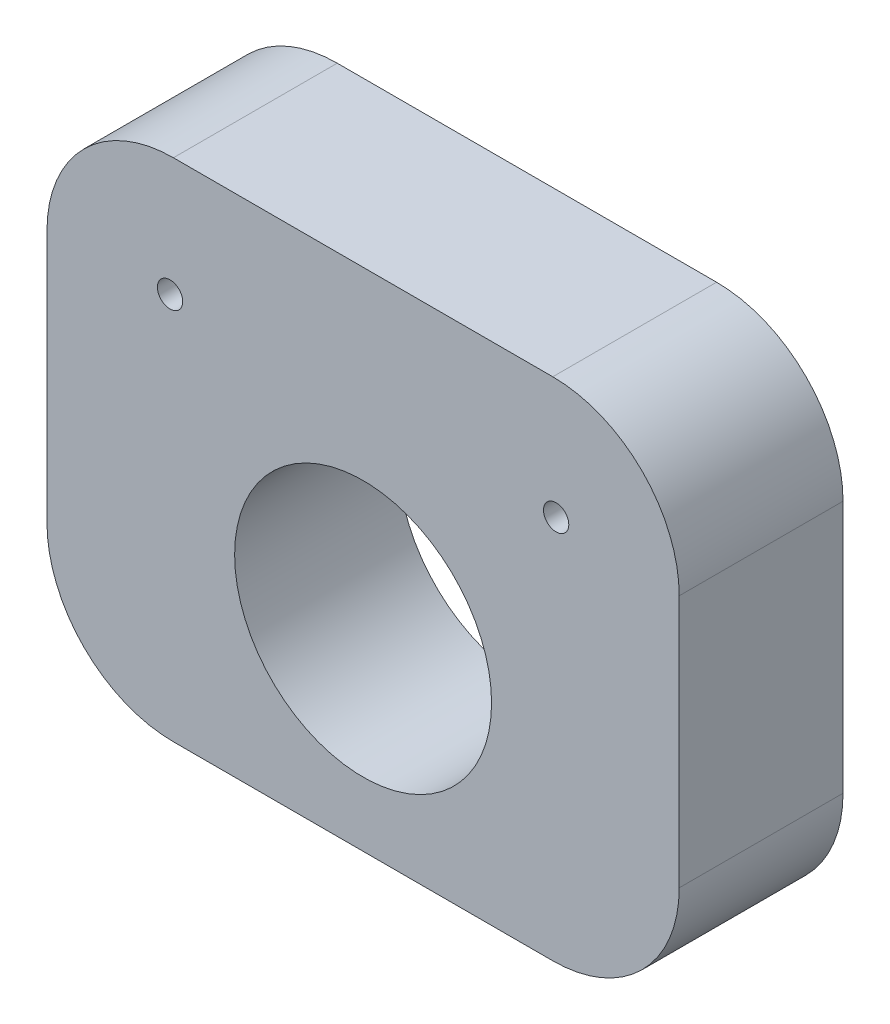
ISO-10303-21;
HEADER;
FILE_DESCRIPTION(('STEP AP214'),'2;1');
FILE_NAME('part.step','',(''),(''),'','','');
FILE_SCHEMA(('AUTOMOTIVE_DESIGN { 1 0 10303 214 1 1 1 1 }'));
ENDSEC;
DATA;
#1=APPLICATION_CONTEXT('core data for automotive mechanical design processes');
#2=APPLICATION_PROTOCOL_DEFINITION('international standard','automotive_design',2000,#1);
#3=PRODUCT_CONTEXT('',#1,'mechanical');
#4=PRODUCT('Part','Part','',(#3));
#5=PRODUCT_RELATED_PRODUCT_CATEGORY('part','',(#4));
#6=PRODUCT_DEFINITION_FORMATION('','',#4);
#7=PRODUCT_DEFINITION_CONTEXT('part definition',#1,'design');
#8=PRODUCT_DEFINITION('design','',#6,#7);
#9=PRODUCT_DEFINITION_SHAPE('','',#8);
#10=(LENGTH_UNIT() NAMED_UNIT(*) SI_UNIT(.MILLI.,.METRE.));
#11=(NAMED_UNIT(*) PLANE_ANGLE_UNIT() SI_UNIT($,.RADIAN.));
#12=(NAMED_UNIT(*) SI_UNIT($,.STERADIAN.) SOLID_ANGLE_UNIT());
#13=UNCERTAINTY_MEASURE_WITH_UNIT(LENGTH_MEASURE(1.E-05),#10,'distance_accuracy_value','');
#14=(GEOMETRIC_REPRESENTATION_CONTEXT(3) GLOBAL_UNCERTAINTY_ASSIGNED_CONTEXT((#13)) GLOBAL_UNIT_ASSIGNED_CONTEXT((#10,
#11,#12)) REPRESENTATION_CONTEXT('',''));
#15=CARTESIAN_POINT('',(0.,0.,0.));
#16=DIRECTION('',(0.,0.,1.));
#17=DIRECTION('',(1.,0.,0.));
#18=AXIS2_PLACEMENT_3D('',#15,#16,#17);
#19=CARTESIAN_POINT('',(-147.757461491775,-155.,0.));
#20=DIRECTION('',(0.,0.,1.));
#21=DIRECTION('',(1.,0.,0.));
#22=AXIS2_PLACEMENT_3D('',#19,#20,#21);
#23=CYLINDRICAL_SURFACE('',#22,5.);
#24=CARTESIAN_POINT('',(-147.757461491775,-155.,6.47700000000003));
#25=DIRECTION('',(0.,0.,-1.));
#26=DIRECTION('',(-1.,0.,0.));
#27=AXIS2_PLACEMENT_3D('',#24,#25,#26);
#28=CIRCLE('',#27,5.);
#29=CARTESIAN_POINT('',(-152.757461491775,-155.,6.47700000000003));
#30=VERTEX_POINT('',#29);
#31=CARTESIAN_POINT('',(-147.757461491775,-150.,6.47700000000003));
#32=VERTEX_POINT('',#31);
#33=EDGE_CURVE('E10',#30,#32,#28,.T.);
#34=ORIENTED_EDGE('',*,*,#33,.T.);
#35=DIRECTION('',(0.,0.,-1.));
#36=VECTOR('',#35,1.);
#37=CARTESIAN_POINT('',(-147.757461491775,-150.,0.));
#38=LINE('',#37,#36);
#39=CARTESIAN_POINT('',(-147.757461491775,-150.,0.));
#40=VERTEX_POINT('',#39);
#41=EDGE_CURVE('E25',#32,#40,#38,.T.);
#42=ORIENTED_EDGE('',*,*,#41,.T.);
#43=CARTESIAN_POINT('',(-147.757461491775,-155.,0.));
#44=DIRECTION('',(0.,0.,1.));
#45=DIRECTION('',(1.,0.,0.));
#46=AXIS2_PLACEMENT_3D('',#43,#44,#45);
#47=CIRCLE('',#46,5.);
#48=CARTESIAN_POINT('',(-152.757461491775,-155.,0.));
#49=VERTEX_POINT('',#48);
#50=EDGE_CURVE('E171',#40,#49,#47,.T.);
#51=ORIENTED_EDGE('',*,*,#50,.T.);
#52=DIRECTION('',(0.,0.,1.));
#53=VECTOR('',#52,1.);
#54=CARTESIAN_POINT('',(-152.757461491775,-155.,0.));
#55=LINE('',#54,#53);
#56=EDGE_CURVE('E218',#49,#30,#55,.T.);
#57=ORIENTED_EDGE('',*,*,#56,.T.);
#58=EDGE_LOOP('',(#34,#42,#51,#57));
#59=FACE_BOUND('',#58,.T.);
#60=ADVANCED_FACE('F15',(#59),#23,.T.);
#61=CARTESIAN_POINT('',(-152.757461491775,-150.,0.));
#62=DIRECTION('',(-1.,0.,0.));
#63=DIRECTION('',(0.,0.,1.));
#64=AXIS2_PLACEMENT_3D('',#61,#62,#63);
#65=PLANE('',#64);
#66=ORIENTED_EDGE('',*,*,#56,.F.);
#67=DIRECTION('',(0.,1.,0.));
#68=VECTOR('',#67,1.);
#69=CARTESIAN_POINT('',(-152.757461491775,-170.,0.));
#70=LINE('',#69,#68);
#71=CARTESIAN_POINT('',(-152.757461491775,-165.,0.));
#72=VERTEX_POINT('',#71);
#73=EDGE_CURVE('E149',#72,#49,#70,.T.);
#74=ORIENTED_EDGE('',*,*,#73,.F.);
#75=DIRECTION('',(0.,0.,-1.));
#76=VECTOR('',#75,1.);
#77=CARTESIAN_POINT('',(-152.757461491775,-165.,0.));
#78=LINE('',#77,#76);
#79=CARTESIAN_POINT('',(-152.757461491775,-165.,6.47700000000003));
#80=VERTEX_POINT('',#79);
#81=EDGE_CURVE('E152',#80,#72,#78,.T.);
#82=ORIENTED_EDGE('',*,*,#81,.F.);
#83=DIRECTION('',(0.,-1.,0.));
#84=VECTOR('',#83,1.);
#85=CARTESIAN_POINT('',(-152.757461491775,-170.,6.47700000000003));
#86=LINE('',#85,#84);
#87=EDGE_CURVE('E103',#30,#80,#86,.T.);
#88=ORIENTED_EDGE('',*,*,#87,.F.);
#89=EDGE_LOOP('',(#66,#74,#82,#88));
#90=FACE_BOUND('',#89,.T.);
#91=ADVANCED_FACE('F185',(#90),#65,.T.);
#92=CARTESIAN_POINT('',(-140.257461491775,-160.,0.));
#93=DIRECTION('',(0.,0.,1.));
#94=DIRECTION('',(1.,0.,0.));
#95=AXIS2_PLACEMENT_3D('',#92,#93,#94);
#96=PLANE('',#95);
#97=CARTESIAN_POINT('',(-147.890679194684,-154.746782297091,0.));
#98=DIRECTION('',(0.,0.,1.));
#99=DIRECTION('',(1.,0.,0.));
#100=AXIS2_PLACEMENT_3D('',#97,#98,#99);
#101=CIRCLE('',#100,0.5);
#102=CARTESIAN_POINT('',(-147.390679194684,-154.746782297091,0.));
#103=VERTEX_POINT('',#102);
#104=EDGE_CURVE('E137',#103,#103,#101,.T.);
#105=ORIENTED_EDGE('',*,*,#104,.T.);
#106=EDGE_LOOP('',(#105));
#107=FACE_BOUND('',#106,.T.);
#108=CARTESIAN_POINT('',(-132.624243788866,-154.746782297091,0.));
#109=DIRECTION('',(0.,0.,1.));
#110=DIRECTION('',(1.,0.,0.));
#111=AXIS2_PLACEMENT_3D('',#108,#109,#110);
#112=CIRCLE('',#111,0.5);
#113=CARTESIAN_POINT('',(-132.124243788866,-154.746782297091,0.));
#114=VERTEX_POINT('',#113);
#115=EDGE_CURVE('E133',#114,#114,#112,.T.);
#116=ORIENTED_EDGE('',*,*,#115,.T.);
#117=EDGE_LOOP('',(#116));
#118=FACE_BOUND('',#117,.T.);
#119=CARTESIAN_POINT('',(-140.257461491775,-162.38,0.));
#120=DIRECTION('',(0.,0.,1.));
#121=DIRECTION('',(1.,0.,0.));
#122=AXIS2_PLACEMENT_3D('',#119,#120,#121);
#123=CIRCLE('',#122,5.07999999999999);
#124=CARTESIAN_POINT('',(-135.177461491775,-162.38,0.));
#125=VERTEX_POINT('',#124);
#126=EDGE_CURVE('E131',#125,#125,#123,.T.);
#127=ORIENTED_EDGE('',*,*,#126,.T.);
#128=EDGE_LOOP('',(#127));
#129=FACE_BOUND('',#128,.T.);
#130=ORIENTED_EDGE('',*,*,#50,.F.);
#131=DIRECTION('',(1.,0.,0.));
#132=VECTOR('',#131,1.);
#133=CARTESIAN_POINT('',(-152.757461491775,-150.,0.));
#134=LINE('',#133,#132);
#135=CARTESIAN_POINT('',(-132.757461491775,-150.,0.));
#136=VERTEX_POINT('',#135);
#137=EDGE_CURVE('E134',#40,#136,#134,.T.);
#138=ORIENTED_EDGE('',*,*,#137,.T.);
#139=CARTESIAN_POINT('',(-132.757461491775,-155.,0.));
#140=DIRECTION('',(0.,0.,1.));
#141=DIRECTION('',(1.,0.,0.));
#142=AXIS2_PLACEMENT_3D('',#139,#140,#141);
#143=CIRCLE('',#142,5.);
#144=CARTESIAN_POINT('',(-127.757461491775,-155.,0.));
#145=VERTEX_POINT('',#144);
#146=EDGE_CURVE('E86',#145,#136,#143,.T.);
#147=ORIENTED_EDGE('',*,*,#146,.F.);
#148=DIRECTION('',(0.,-1.,0.));
#149=VECTOR('',#148,1.);
#150=CARTESIAN_POINT('',(-127.757461491775,-150.,0.));
#151=LINE('',#150,#149);
#152=CARTESIAN_POINT('',(-127.757461491775,-165.,0.));
#153=VERTEX_POINT('',#152);
#154=EDGE_CURVE('E83',#145,#153,#151,.T.);
#155=ORIENTED_EDGE('',*,*,#154,.T.);
#156=CARTESIAN_POINT('',(-132.757461491775,-165.,0.));
#157=DIRECTION('',(0.,0.,1.));
#158=DIRECTION('',(1.,0.,0.));
#159=AXIS2_PLACEMENT_3D('',#156,#157,#158);
#160=CIRCLE('',#159,5.);
#161=CARTESIAN_POINT('',(-132.757461491775,-170.,0.));
#162=VERTEX_POINT('',#161);
#163=EDGE_CURVE('E116',#162,#153,#160,.T.);
#164=ORIENTED_EDGE('',*,*,#163,.F.);
#165=DIRECTION('',(-1.,0.,0.));
#166=VECTOR('',#165,1.);
#167=CARTESIAN_POINT('',(-127.757461491775,-170.,0.));
#168=LINE('',#167,#166);
#169=CARTESIAN_POINT('',(-147.757461491775,-170.,0.));
#170=VERTEX_POINT('',#169);
#171=EDGE_CURVE('E145',#162,#170,#168,.T.);
#172=ORIENTED_EDGE('',*,*,#171,.T.);
#173=CARTESIAN_POINT('',(-147.757461491775,-165.,0.));
#174=DIRECTION('',(0.,0.,1.));
#175=DIRECTION('',(1.,0.,0.));
#176=AXIS2_PLACEMENT_3D('',#173,#174,#175);
#177=CIRCLE('',#176,5.);
#178=EDGE_CURVE('E150',#72,#170,#177,.T.);
#179=ORIENTED_EDGE('',*,*,#178,.F.);
#180=ORIENTED_EDGE('',*,*,#73,.T.);
#181=EDGE_LOOP('',(#130,#138,#147,#155,#164,#172,#179,#180));
#182=FACE_BOUND('',#181,.T.);
#183=ADVANCED_FACE('F168',(#107,#118,#129,#182),#96,.F.);
#184=CARTESIAN_POINT('',(-147.757461491775,-165.,0.));
#185=DIRECTION('',(0.,0.,1.));
#186=DIRECTION('',(1.,0.,0.));
#187=AXIS2_PLACEMENT_3D('',#184,#185,#186);
#188=CYLINDRICAL_SURFACE('',#187,5.);
#189=CARTESIAN_POINT('',(-147.757461491775,-165.,6.47700000000003));
#190=DIRECTION('',(0.,0.,-1.));
#191=DIRECTION('',(-1.,0.,0.));
#192=AXIS2_PLACEMENT_3D('',#189,#190,#191);
#193=CIRCLE('',#192,5.);
#194=CARTESIAN_POINT('',(-147.757461491775,-170.,6.47700000000003));
#195=VERTEX_POINT('',#194);
#196=EDGE_CURVE('E153',#195,#80,#193,.T.);
#197=ORIENTED_EDGE('',*,*,#196,.T.);
#198=ORIENTED_EDGE('',*,*,#81,.T.);
#199=ORIENTED_EDGE('',*,*,#178,.T.);
#200=DIRECTION('',(0.,0.,1.));
#201=VECTOR('',#200,1.);
#202=CARTESIAN_POINT('',(-147.757461491775,-170.,0.));
#203=LINE('',#202,#201);
#204=EDGE_CURVE('E93',#170,#195,#203,.T.);
#205=ORIENTED_EDGE('',*,*,#204,.T.);
#206=EDGE_LOOP('',(#197,#198,#199,#205));
#207=FACE_BOUND('',#206,.T.);
#208=ADVANCED_FACE('F200',(#207),#188,.T.);
#209=CARTESIAN_POINT('',(-152.757461491775,-170.,0.));
#210=DIRECTION('',(0.,-1.,0.));
#211=DIRECTION('',(0.,0.,-1.));
#212=AXIS2_PLACEMENT_3D('',#209,#210,#211);
#213=PLANE('',#212);
#214=ORIENTED_EDGE('',*,*,#204,.F.);
#215=ORIENTED_EDGE('',*,*,#171,.F.);
#216=DIRECTION('',(0.,0.,-1.));
#217=VECTOR('',#216,1.);
#218=CARTESIAN_POINT('',(-132.757461491775,-170.,0.));
#219=LINE('',#218,#217);
#220=CARTESIAN_POINT('',(-132.757461491775,-170.,6.47700000000003));
#221=VERTEX_POINT('',#220);
#222=EDGE_CURVE('E113',#221,#162,#219,.T.);
#223=ORIENTED_EDGE('',*,*,#222,.F.);
#224=DIRECTION('',(1.,0.,0.));
#225=VECTOR('',#224,1.);
#226=CARTESIAN_POINT('',(-127.757461491775,-170.,6.47700000000003));
#227=LINE('',#226,#225);
#228=EDGE_CURVE('E101',#195,#221,#227,.T.);
#229=ORIENTED_EDGE('',*,*,#228,.F.);
#230=EDGE_LOOP('',(#214,#215,#223,#229));
#231=FACE_BOUND('',#230,.T.);
#232=ADVANCED_FACE('F165',(#231),#213,.T.);
#233=CARTESIAN_POINT('',(-132.757461491775,-155.,0.));
#234=DIRECTION('',(0.,0.,1.));
#235=DIRECTION('',(1.,0.,0.));
#236=AXIS2_PLACEMENT_3D('',#233,#234,#235);
#237=CYLINDRICAL_SURFACE('',#236,5.);
#238=CARTESIAN_POINT('',(-132.757461491775,-155.,6.47700000000003));
#239=DIRECTION('',(0.,0.,-1.));
#240=DIRECTION('',(-1.,0.,0.));
#241=AXIS2_PLACEMENT_3D('',#238,#239,#240);
#242=CIRCLE('',#241,5.);
#243=CARTESIAN_POINT('',(-132.757461491775,-150.,6.47700000000003));
#244=VERTEX_POINT('',#243);
#245=CARTESIAN_POINT('',(-127.757461491775,-155.,6.47700000000003));
#246=VERTEX_POINT('',#245);
#247=EDGE_CURVE('E85',#244,#246,#242,.T.);
#248=ORIENTED_EDGE('',*,*,#247,.T.);
#249=DIRECTION('',(0.,0.,-1.));
#250=VECTOR('',#249,1.);
#251=CARTESIAN_POINT('',(-127.757461491775,-155.,0.));
#252=LINE('',#251,#250);
#253=EDGE_CURVE('E77',#246,#145,#252,.T.);
#254=ORIENTED_EDGE('',*,*,#253,.T.);
#255=ORIENTED_EDGE('',*,*,#146,.T.);
#256=DIRECTION('',(0.,0.,1.));
#257=VECTOR('',#256,1.);
#258=CARTESIAN_POINT('',(-132.757461491775,-150.,0.));
#259=LINE('',#258,#257);
#260=EDGE_CURVE('E90',#136,#244,#259,.T.);
#261=ORIENTED_EDGE('',*,*,#260,.T.);
#262=EDGE_LOOP('',(#248,#254,#255,#261));
#263=FACE_BOUND('',#262,.T.);
#264=ADVANCED_FACE('F17',(#263),#237,.T.);
#265=CARTESIAN_POINT('',(-127.757461491775,-150.,0.));
#266=DIRECTION('',(0.,1.,0.));
#267=DIRECTION('',(0.,0.,1.));
#268=AXIS2_PLACEMENT_3D('',#265,#266,#267);
#269=PLANE('',#268);
#270=ORIENTED_EDGE('',*,*,#41,.F.);
#271=DIRECTION('',(-1.,0.,0.));
#272=VECTOR('',#271,1.);
#273=CARTESIAN_POINT('',(-152.757461491775,-150.,6.47700000000003));
#274=LINE('',#273,#272);
#275=EDGE_CURVE('E102',#244,#32,#274,.T.);
#276=ORIENTED_EDGE('',*,*,#275,.F.);
#277=ORIENTED_EDGE('',*,*,#260,.F.);
#278=ORIENTED_EDGE('',*,*,#137,.F.);
#279=EDGE_LOOP('',(#270,#276,#277,#278));
#280=FACE_BOUND('',#279,.T.);
#281=ADVANCED_FACE('F172',(#280),#269,.T.);
#282=CARTESIAN_POINT('',(-132.757461491775,-165.,0.));
#283=DIRECTION('',(0.,0.,1.));
#284=DIRECTION('',(1.,0.,0.));
#285=AXIS2_PLACEMENT_3D('',#282,#283,#284);
#286=CYLINDRICAL_SURFACE('',#285,5.);
#287=CARTESIAN_POINT('',(-132.757461491775,-165.,6.47700000000003));
#288=DIRECTION('',(0.,0.,-1.));
#289=DIRECTION('',(-1.,0.,0.));
#290=AXIS2_PLACEMENT_3D('',#287,#288,#289);
#291=CIRCLE('',#290,5.);
#292=CARTESIAN_POINT('',(-127.757461491775,-165.,6.47700000000003));
#293=VERTEX_POINT('',#292);
#294=EDGE_CURVE('E100',#293,#221,#291,.T.);
#295=ORIENTED_EDGE('',*,*,#294,.T.);
#296=ORIENTED_EDGE('',*,*,#222,.T.);
#297=ORIENTED_EDGE('',*,*,#163,.T.);
#298=DIRECTION('',(0.,0.,1.));
#299=VECTOR('',#298,1.);
#300=CARTESIAN_POINT('',(-127.757461491775,-165.,0.));
#301=LINE('',#300,#299);
#302=EDGE_CURVE('E114',#153,#293,#301,.T.);
#303=ORIENTED_EDGE('',*,*,#302,.T.);
#304=EDGE_LOOP('',(#295,#296,#297,#303));
#305=FACE_BOUND('',#304,.T.);
#306=ADVANCED_FACE('F160',(#305),#286,.T.);
#307=CARTESIAN_POINT('',(-147.890679194684,-154.746782297091,0.));
#308=DIRECTION('',(0.,0.,1.));
#309=DIRECTION('',(1.,0.,0.));
#310=AXIS2_PLACEMENT_3D('',#307,#308,#309);
#311=CYLINDRICAL_SURFACE('',#310,0.5);
#312=CARTESIAN_POINT('',(-147.890679194684,-154.746782297091,6.47700000000003));
#313=DIRECTION('',(0.,0.,-1.));
#314=DIRECTION('',(-1.,0.,0.));
#315=AXIS2_PLACEMENT_3D('',#312,#313,#314);
#316=CIRCLE('',#315,0.5);
#317=CARTESIAN_POINT('',(-148.390679194684,-154.746782297091,6.47700000000003));
#318=VERTEX_POINT('',#317);
#319=EDGE_CURVE('E105',#318,#318,#316,.T.);
#320=ORIENTED_EDGE('',*,*,#319,.F.);
#321=EDGE_LOOP('',(#320));
#322=FACE_BOUND('',#321,.T.);
#323=ORIENTED_EDGE('',*,*,#104,.F.);
#324=EDGE_LOOP('',(#323));
#325=FACE_BOUND('',#324,.T.);
#326=ADVANCED_FACE('F180',(#322,#325),#311,.F.);
#327=CARTESIAN_POINT('',(-132.624243788866,-154.746782297091,0.));
#328=DIRECTION('',(0.,0.,1.));
#329=DIRECTION('',(1.,0.,0.));
#330=AXIS2_PLACEMENT_3D('',#327,#328,#329);
#331=CYLINDRICAL_SURFACE('',#330,0.5);
#332=CARTESIAN_POINT('',(-132.624243788866,-154.746782297091,6.47700000000003));
#333=DIRECTION('',(0.,0.,-1.));
#334=DIRECTION('',(-1.,0.,0.));
#335=AXIS2_PLACEMENT_3D('',#332,#333,#334);
#336=CIRCLE('',#335,0.5);
#337=CARTESIAN_POINT('',(-133.124243788866,-154.746782297091,6.47700000000003));
#338=VERTEX_POINT('',#337);
#339=EDGE_CURVE('E108',#338,#338,#336,.T.);
#340=ORIENTED_EDGE('',*,*,#339,.F.);
#341=EDGE_LOOP('',(#340));
#342=FACE_BOUND('',#341,.T.);
#343=ORIENTED_EDGE('',*,*,#115,.F.);
#344=EDGE_LOOP('',(#343));
#345=FACE_BOUND('',#344,.T.);
#346=ADVANCED_FACE('F127',(#342,#345),#331,.F.);
#347=CARTESIAN_POINT('',(-140.257461491775,-162.38,0.));
#348=DIRECTION('',(0.,0.,1.));
#349=DIRECTION('',(1.,0.,0.));
#350=AXIS2_PLACEMENT_3D('',#347,#348,#349);
#351=CYLINDRICAL_SURFACE('',#350,5.07999999999999);
#352=CARTESIAN_POINT('',(-140.257461491775,-162.38,6.47700000000003));
#353=DIRECTION('',(0.,0.,-1.));
#354=DIRECTION('',(-1.,0.,0.));
#355=AXIS2_PLACEMENT_3D('',#352,#353,#354);
#356=CIRCLE('',#355,5.07999999999999);
#357=CARTESIAN_POINT('',(-145.337461491775,-162.38,6.47700000000003));
#358=VERTEX_POINT('',#357);
#359=EDGE_CURVE('E119',#358,#358,#356,.T.);
#360=ORIENTED_EDGE('',*,*,#359,.F.);
#361=EDGE_LOOP('',(#360));
#362=FACE_BOUND('',#361,.T.);
#363=ORIENTED_EDGE('',*,*,#126,.F.);
#364=EDGE_LOOP('',(#363));
#365=FACE_BOUND('',#364,.T.);
#366=ADVANCED_FACE('F124',(#362,#365),#351,.F.);
#367=CARTESIAN_POINT('',(-127.757461491775,-170.,0.));
#368=DIRECTION('',(1.,0.,0.));
#369=DIRECTION('',(0.,1.,0.));
#370=AXIS2_PLACEMENT_3D('',#367,#368,#369);
#371=PLANE('',#370);
#372=ORIENTED_EDGE('',*,*,#253,.F.);
#373=DIRECTION('',(0.,1.,0.));
#374=VECTOR('',#373,1.);
#375=CARTESIAN_POINT('',(-127.757461491775,-150.,6.47700000000003));
#376=LINE('',#375,#374);
#377=EDGE_CURVE('E19',#293,#246,#376,.T.);
#378=ORIENTED_EDGE('',*,*,#377,.F.);
#379=ORIENTED_EDGE('',*,*,#302,.F.);
#380=ORIENTED_EDGE('',*,*,#154,.F.);
#381=EDGE_LOOP('',(#372,#378,#379,#380));
#382=FACE_BOUND('',#381,.T.);
#383=ADVANCED_FACE('F79',(#382),#371,.T.);
#384=CARTESIAN_POINT('',(-140.257461491775,-160.,6.47700000000003));
#385=DIRECTION('',(0.,0.,1.));
#386=DIRECTION('',(1.,0.,0.));
#387=AXIS2_PLACEMENT_3D('',#384,#385,#386);
#388=PLANE('',#387);
#389=ORIENTED_EDGE('',*,*,#33,.F.);
#390=ORIENTED_EDGE('',*,*,#87,.T.);
#391=ORIENTED_EDGE('',*,*,#196,.F.);
#392=ORIENTED_EDGE('',*,*,#228,.T.);
#393=ORIENTED_EDGE('',*,*,#294,.F.);
#394=ORIENTED_EDGE('',*,*,#377,.T.);
#395=ORIENTED_EDGE('',*,*,#247,.F.);
#396=ORIENTED_EDGE('',*,*,#275,.T.);
#397=EDGE_LOOP('',(#389,#390,#391,#392,#393,#394,#395,#396));
#398=FACE_BOUND('',#397,.T.);
#399=ORIENTED_EDGE('',*,*,#319,.T.);
#400=EDGE_LOOP('',(#399));
#401=FACE_BOUND('',#400,.T.);
#402=ORIENTED_EDGE('',*,*,#339,.T.);
#403=EDGE_LOOP('',(#402));
#404=FACE_BOUND('',#403,.T.);
#405=ORIENTED_EDGE('',*,*,#359,.T.);
#406=EDGE_LOOP('',(#405));
#407=FACE_BOUND('',#406,.T.);
#408=ADVANCED_FACE('F97',(#398,#401,#404,#407),#388,.T.);
#409=CLOSED_SHELL('',(#60,#91,#183,#208,#232,#264,#281,#306,#326,#346,#366,#383,#408));
#410=MANIFOLD_SOLID_BREP('B1',#409);
#411=ADVANCED_BREP_SHAPE_REPRESENTATION('',(#18,#410),#14);
#412=SHAPE_DEFINITION_REPRESENTATION(#9,#411);
ENDSEC;
END-ISO-10303-21;
